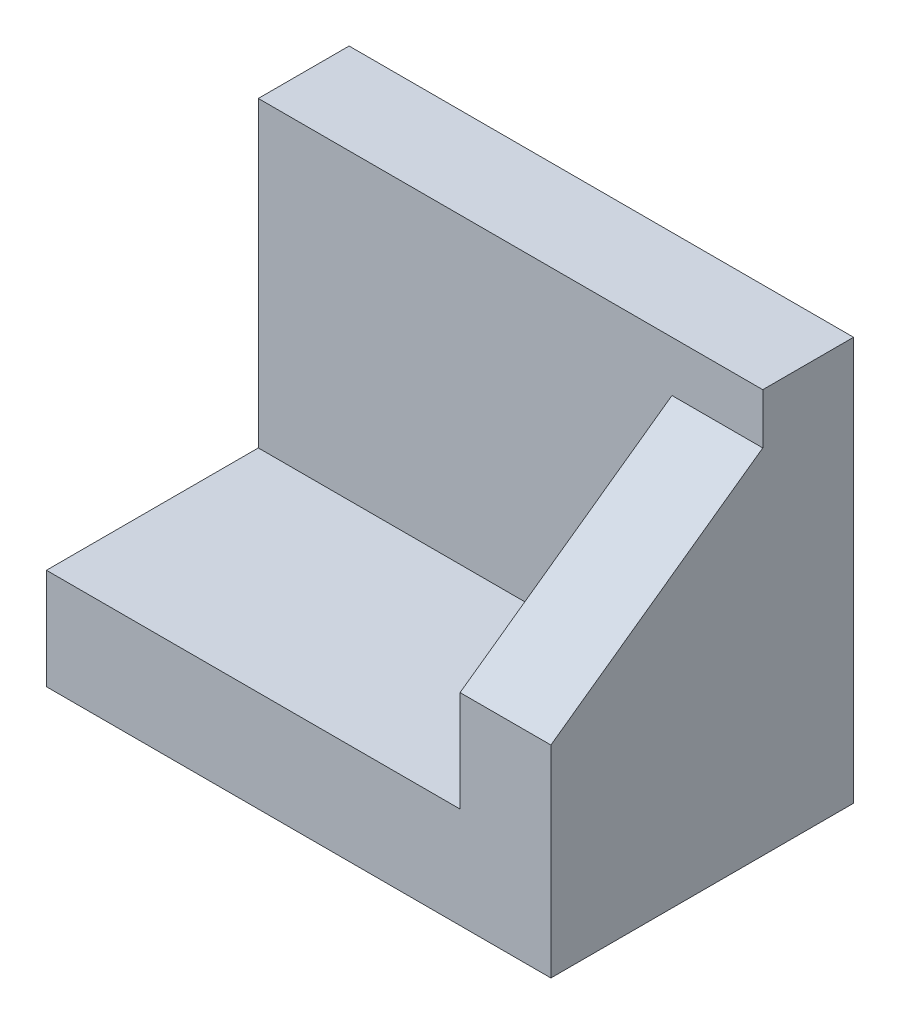
ISO-10303-21;
HEADER;
FILE_DESCRIPTION(('STEP AP214'),'2;1');
FILE_NAME('part.step','',(''),(''),'','','');
FILE_SCHEMA(('AUTOMOTIVE_DESIGN { 1 0 10303 214 1 1 1 1 }'));
ENDSEC;
DATA;
#1=APPLICATION_CONTEXT('core data for automotive mechanical design processes');
#2=APPLICATION_PROTOCOL_DEFINITION('international standard','automotive_design',2000,#1);
#3=PRODUCT_CONTEXT('',#1,'mechanical');
#4=PRODUCT('Part','Part','',(#3));
#5=PRODUCT_RELATED_PRODUCT_CATEGORY('part','',(#4));
#6=PRODUCT_DEFINITION_FORMATION('','',#4);
#7=PRODUCT_DEFINITION_CONTEXT('part definition',#1,'design');
#8=PRODUCT_DEFINITION('design','',#6,#7);
#9=PRODUCT_DEFINITION_SHAPE('','',#8);
#10=(LENGTH_UNIT() NAMED_UNIT(*) SI_UNIT(.MILLI.,.METRE.));
#11=(NAMED_UNIT(*) PLANE_ANGLE_UNIT() SI_UNIT($,.RADIAN.));
#12=(NAMED_UNIT(*) SI_UNIT($,.STERADIAN.) SOLID_ANGLE_UNIT());
#13=UNCERTAINTY_MEASURE_WITH_UNIT(LENGTH_MEASURE(1.E-05),#10,'distance_accuracy_value','');
#14=(GEOMETRIC_REPRESENTATION_CONTEXT(3) GLOBAL_UNCERTAINTY_ASSIGNED_CONTEXT((#13)) GLOBAL_UNIT_ASSIGNED_CONTEXT((#10,
#11,#12)) REPRESENTATION_CONTEXT('',''));
#15=CARTESIAN_POINT('',(0.,0.,0.));
#16=DIRECTION('',(0.,0.,1.));
#17=DIRECTION('',(1.,0.,0.));
#18=AXIS2_PLACEMENT_3D('',#15,#16,#17);
#19=CARTESIAN_POINT('',(0.,0.,18.));
#20=DIRECTION('',(0.,0.,-1.));
#21=DIRECTION('',(-1.,0.,0.));
#22=AXIS2_PLACEMENT_3D('',#19,#20,#21);
#23=PLANE('',#22);
#24=DIRECTION('',(0.,1.,0.));
#25=VECTOR('',#24,1.);
#26=CARTESIAN_POINT('',(82.,20.,18.));
#27=LINE('',#26,#25);
#28=CARTESIAN_POINT('',(82.,20.,18.));
#29=VERTEX_POINT('',#28);
#30=CARTESIAN_POINT('',(82.,70.,18.));
#31=VERTEX_POINT('',#30);
#32=EDGE_CURVE('E84',#29,#31,#27,.T.);
#33=ORIENTED_EDGE('',*,*,#32,.T.);
#34=DIRECTION('',(-1.,0.,0.));
#35=VECTOR('',#34,1.);
#36=CARTESIAN_POINT('',(0.,70.,18.));
#37=LINE('',#36,#35);
#38=CARTESIAN_POINT('',(100.,70.,18.));
#39=VERTEX_POINT('',#38);
#40=EDGE_CURVE('E89',#39,#31,#37,.T.);
#41=ORIENTED_EDGE('',*,*,#40,.F.);
#42=DIRECTION('',(0.,-1.,0.));
#43=VECTOR('',#42,1.);
#44=CARTESIAN_POINT('',(100.,80.,18.));
#45=LINE('',#44,#43);
#46=CARTESIAN_POINT('',(100.,80.,18.));
#47=VERTEX_POINT('',#46);
#48=EDGE_CURVE('E76',#47,#39,#45,.T.);
#49=ORIENTED_EDGE('',*,*,#48,.F.);
#50=CARTESIAN_POINT('',(0.,80.,18.));
#51=DIRECTION('',(1.,0.,0.));
#52=VECTOR('',#51,1.);
#53=LINE('',#50,#52);
#54=CARTESIAN_POINT('',(0.,80.,18.));
#55=VERTEX_POINT('',#54);
#56=EDGE_CURVE('E422',#55,#47,#53,.T.);
#57=ORIENTED_EDGE('',*,*,#56,.F.);
#58=DIRECTION('',(0.,-1.,0.));
#59=VECTOR('',#58,1.);
#60=CARTESIAN_POINT('',(0.,80.,18.));
#61=LINE('',#60,#59);
#62=CARTESIAN_POINT('',(0.,20.,18.));
#63=VERTEX_POINT('',#62);
#64=EDGE_CURVE('E297',#55,#63,#61,.T.);
#65=ORIENTED_EDGE('',*,*,#64,.T.);
#66=CARTESIAN_POINT('',(0.,20.,18.));
#67=DIRECTION('',(1.,0.,0.));
#68=VECTOR('',#67,1.);
#69=LINE('',#66,#68);
#70=EDGE_CURVE('E404',#63,#29,#69,.T.);
#71=ORIENTED_EDGE('',*,*,#70,.T.);
#72=EDGE_LOOP('',(#33,#41,#49,#57,#65,#71));
#73=FACE_BOUND('',#72,.T.);
#74=ADVANCED_FACE('F65',(#73),#23,.F.);
#75=CARTESIAN_POINT('',(0.,20.,0.));
#76=DIRECTION('',(0.,-1.,0.));
#77=DIRECTION('',(0.,0.,-1.));
#78=AXIS2_PLACEMENT_3D('',#75,#76,#77);
#79=PLANE('',#78);
#80=DIRECTION('',(0.,0.,-1.));
#81=VECTOR('',#80,1.);
#82=CARTESIAN_POINT('',(82.,20.,60.));
#83=LINE('',#82,#81);
#84=CARTESIAN_POINT('',(82.,20.,60.));
#85=VERTEX_POINT('',#84);
#86=EDGE_CURVE('E143',#85,#29,#83,.T.);
#87=ORIENTED_EDGE('',*,*,#86,.T.);
#88=ORIENTED_EDGE('',*,*,#70,.F.);
#89=DIRECTION('',(0.,0.,1.));
#90=VECTOR('',#89,1.);
#91=CARTESIAN_POINT('',(0.,20.,18.));
#92=LINE('',#91,#90);
#93=CARTESIAN_POINT('',(0.,20.,60.));
#94=VERTEX_POINT('',#93);
#95=EDGE_CURVE('E345',#63,#94,#92,.T.);
#96=ORIENTED_EDGE('',*,*,#95,.T.);
#97=CARTESIAN_POINT('',(0.,20.,60.));
#98=DIRECTION('',(1.,0.,0.));
#99=VECTOR('',#98,1.);
#100=LINE('',#97,#99);
#101=EDGE_CURVE('E402',#94,#85,#100,.T.);
#102=ORIENTED_EDGE('',*,*,#101,.T.);
#103=EDGE_LOOP('',(#87,#88,#96,#102));
#104=FACE_BOUND('',#103,.T.);
#105=ADVANCED_FACE('F186',(#104),#79,.F.);
#106=CARTESIAN_POINT('',(100.,0.,0.));
#107=DIRECTION('',(1.,0.,0.));
#108=DIRECTION('',(0.,0.,-1.));
#109=AXIS2_PLACEMENT_3D('',#106,#107,#108);
#110=PLANE('',#109);
#111=ORIENTED_EDGE('',*,*,#48,.T.);
#112=DIRECTION('',(0.,-0.581238193719096,0.813733471206735));
#113=VECTOR('',#112,1.);
#114=CARTESIAN_POINT('',(100.,70.,18.));
#115=LINE('',#114,#113);
#116=CARTESIAN_POINT('',(100.,40.,60.));
#117=VERTEX_POINT('',#116);
#118=EDGE_CURVE('E169',#39,#117,#115,.T.);
#119=ORIENTED_EDGE('',*,*,#118,.T.);
#120=DIRECTION('',(0.,-1.,0.));
#121=VECTOR('',#120,1.);
#122=CARTESIAN_POINT('',(100.,40.,60.));
#123=LINE('',#122,#121);
#124=CARTESIAN_POINT('',(100.,20.,60.));
#125=VERTEX_POINT('',#124);
#126=EDGE_CURVE('E166',#117,#125,#123,.T.);
#127=ORIENTED_EDGE('',*,*,#126,.T.);
#128=DIRECTION('',(0.,-1.,0.));
#129=VECTOR('',#128,1.);
#130=CARTESIAN_POINT('',(100.,20.,60.));
#131=LINE('',#130,#129);
#132=CARTESIAN_POINT('',(100.,0.,60.));
#133=VERTEX_POINT('',#132);
#134=EDGE_CURVE('E12',#125,#133,#131,.T.);
#135=ORIENTED_EDGE('',*,*,#134,.T.);
#136=DIRECTION('',(0.,0.,-1.));
#137=VECTOR('',#136,1.);
#138=CARTESIAN_POINT('',(100.,0.,60.));
#139=LINE('',#138,#137);
#140=CARTESIAN_POINT('',(100.,0.,0.));
#141=VERTEX_POINT('',#140);
#142=EDGE_CURVE('E224',#133,#141,#139,.T.);
#143=ORIENTED_EDGE('',*,*,#142,.T.);
#144=DIRECTION('',(0.,1.,0.));
#145=VECTOR('',#144,1.);
#146=CARTESIAN_POINT('',(100.,0.,0.));
#147=LINE('',#146,#145);
#148=CARTESIAN_POINT('',(100.,80.,0.));
#149=VERTEX_POINT('',#148);
#150=EDGE_CURVE('E428',#141,#149,#147,.T.);
#151=ORIENTED_EDGE('',*,*,#150,.T.);
#152=DIRECTION('',(0.,0.,1.));
#153=VECTOR('',#152,1.);
#154=CARTESIAN_POINT('',(100.,80.,0.));
#155=LINE('',#154,#153);
#156=EDGE_CURVE('E433',#149,#47,#155,.T.);
#157=ORIENTED_EDGE('',*,*,#156,.T.);
#158=EDGE_LOOP('',(#111,#119,#127,#135,#143,#151,#157));
#159=FACE_BOUND('',#158,.T.);
#160=ADVANCED_FACE('F67',(#159),#110,.T.);
#161=CARTESIAN_POINT('',(0.,0.,0.));
#162=DIRECTION('',(1.,0.,0.));
#163=DIRECTION('',(0.,0.,-1.));
#164=AXIS2_PLACEMENT_3D('',#161,#162,#163);
#165=PLANE('',#164);
#166=DIRECTION('',(0.,0.,-1.));
#167=VECTOR('',#166,1.);
#168=CARTESIAN_POINT('',(0.,0.,60.));
#169=LINE('',#168,#167);
#170=CARTESIAN_POINT('',(0.,0.,60.));
#171=VERTEX_POINT('',#170);
#172=CARTESIAN_POINT('',(0.,0.,0.));
#173=VERTEX_POINT('',#172);
#174=EDGE_CURVE('E337',#171,#173,#169,.T.);
#175=ORIENTED_EDGE('',*,*,#174,.F.);
#176=DIRECTION('',(0.,-1.,0.));
#177=VECTOR('',#176,1.);
#178=CARTESIAN_POINT('',(0.,20.,60.));
#179=LINE('',#178,#177);
#180=EDGE_CURVE('E340',#94,#171,#179,.T.);
#181=ORIENTED_EDGE('',*,*,#180,.F.);
#182=ORIENTED_EDGE('',*,*,#95,.F.);
#183=ORIENTED_EDGE('',*,*,#64,.F.);
#184=DIRECTION('',(0.,0.,1.));
#185=VECTOR('',#184,1.);
#186=CARTESIAN_POINT('',(0.,80.,0.));
#187=LINE('',#186,#185);
#188=CARTESIAN_POINT('',(0.,80.,0.));
#189=VERTEX_POINT('',#188);
#190=EDGE_CURVE('E285',#189,#55,#187,.T.);
#191=ORIENTED_EDGE('',*,*,#190,.F.);
#192=DIRECTION('',(0.,1.,0.));
#193=VECTOR('',#192,1.);
#194=CARTESIAN_POINT('',(0.,0.,0.));
#195=LINE('',#194,#193);
#196=EDGE_CURVE('E271',#173,#189,#195,.T.);
#197=ORIENTED_EDGE('',*,*,#196,.F.);
#198=EDGE_LOOP('',(#175,#181,#182,#183,#191,#197));
#199=FACE_BOUND('',#198,.T.);
#200=ADVANCED_FACE('F355',(#199),#165,.F.);
#201=CARTESIAN_POINT('',(0.,0.,0.));
#202=DIRECTION('',(0.,0.,1.));
#203=DIRECTION('',(1.,0.,0.));
#204=AXIS2_PLACEMENT_3D('',#201,#202,#203);
#205=PLANE('',#204);
#206=CARTESIAN_POINT('',(0.,80.,0.));
#207=DIRECTION('',(1.,0.,0.));
#208=VECTOR('',#207,1.);
#209=LINE('',#206,#208);
#210=EDGE_CURVE('E344',#189,#149,#209,.T.);
#211=ORIENTED_EDGE('',*,*,#210,.T.);
#212=ORIENTED_EDGE('',*,*,#150,.F.);
#213=CARTESIAN_POINT('',(0.,0.,0.));
#214=DIRECTION('',(1.,0.,0.));
#215=VECTOR('',#214,1.);
#216=LINE('',#213,#215);
#217=EDGE_CURVE('E423',#173,#141,#216,.T.);
#218=ORIENTED_EDGE('',*,*,#217,.F.);
#219=ORIENTED_EDGE('',*,*,#196,.T.);
#220=EDGE_LOOP('',(#211,#212,#218,#219));
#221=FACE_BOUND('',#220,.T.);
#222=ADVANCED_FACE('F240',(#221),#205,.F.);
#223=CARTESIAN_POINT('',(0.,0.,0.));
#224=DIRECTION('',(0.,1.,0.));
#225=DIRECTION('',(0.,0.,1.));
#226=AXIS2_PLACEMENT_3D('',#223,#224,#225);
#227=PLANE('',#226);
#228=ORIENTED_EDGE('',*,*,#217,.T.);
#229=ORIENTED_EDGE('',*,*,#142,.F.);
#230=CARTESIAN_POINT('',(0.,0.,60.));
#231=DIRECTION('',(1.,0.,0.));
#232=VECTOR('',#231,1.);
#233=LINE('',#230,#232);
#234=EDGE_CURVE('E405',#171,#133,#233,.T.);
#235=ORIENTED_EDGE('',*,*,#234,.F.);
#236=ORIENTED_EDGE('',*,*,#174,.T.);
#237=EDGE_LOOP('',(#228,#229,#235,#236));
#238=FACE_BOUND('',#237,.T.);
#239=ADVANCED_FACE('F230',(#238),#227,.F.);
#240=CARTESIAN_POINT('',(0.,80.,0.));
#241=DIRECTION('',(0.,-1.,0.));
#242=DIRECTION('',(0.,0.,-1.));
#243=AXIS2_PLACEMENT_3D('',#240,#241,#242);
#244=PLANE('',#243);
#245=ORIENTED_EDGE('',*,*,#56,.T.);
#246=ORIENTED_EDGE('',*,*,#156,.F.);
#247=ORIENTED_EDGE('',*,*,#210,.F.);
#248=ORIENTED_EDGE('',*,*,#190,.T.);
#249=EDGE_LOOP('',(#245,#246,#247,#248));
#250=FACE_BOUND('',#249,.T.);
#251=ADVANCED_FACE('F185',(#250),#244,.F.);
#252=CARTESIAN_POINT('',(0.,0.,60.));
#253=DIRECTION('',(0.,0.,-1.));
#254=DIRECTION('',(-1.,0.,0.));
#255=AXIS2_PLACEMENT_3D('',#252,#253,#254);
#256=PLANE('',#255);
#257=ORIENTED_EDGE('',*,*,#234,.T.);
#258=ORIENTED_EDGE('',*,*,#134,.F.);
#259=ORIENTED_EDGE('',*,*,#126,.F.);
#260=CARTESIAN_POINT('',(82.,40.,60.));
#261=DIRECTION('',(1.,0.,0.));
#262=VECTOR('',#261,1.);
#263=LINE('',#260,#262);
#264=CARTESIAN_POINT('',(82.,40.,60.));
#265=VERTEX_POINT('',#264);
#266=EDGE_CURVE('E155',#265,#117,#263,.T.);
#267=ORIENTED_EDGE('',*,*,#266,.F.);
#268=DIRECTION('',(0.,-1.,0.));
#269=VECTOR('',#268,1.);
#270=CARTESIAN_POINT('',(82.,40.,60.));
#271=LINE('',#270,#269);
#272=EDGE_CURVE('E137',#265,#85,#271,.T.);
#273=ORIENTED_EDGE('',*,*,#272,.T.);
#274=ORIENTED_EDGE('',*,*,#101,.F.);
#275=ORIENTED_EDGE('',*,*,#180,.T.);
#276=EDGE_LOOP('',(#257,#258,#259,#267,#273,#274,#275));
#277=FACE_BOUND('',#276,.T.);
#278=ADVANCED_FACE('F164',(#277),#256,.F.);
#279=CARTESIAN_POINT('',(82.,0.,0.));
#280=DIRECTION('',(1.,0.,0.));
#281=DIRECTION('',(0.,0.,-1.));
#282=AXIS2_PLACEMENT_3D('',#279,#280,#281);
#283=PLANE('',#282);
#284=ORIENTED_EDGE('',*,*,#86,.F.);
#285=ORIENTED_EDGE('',*,*,#272,.F.);
#286=DIRECTION('',(0.,-0.581238193719096,0.813733471206735));
#287=VECTOR('',#286,1.);
#288=CARTESIAN_POINT('',(82.,70.,18.));
#289=LINE('',#288,#287);
#290=EDGE_CURVE('E141',#31,#265,#289,.T.);
#291=ORIENTED_EDGE('',*,*,#290,.F.);
#292=ORIENTED_EDGE('',*,*,#32,.F.);
#293=EDGE_LOOP('',(#284,#285,#291,#292));
#294=FACE_BOUND('',#293,.T.);
#295=ADVANCED_FACE('F140',(#294),#283,.F.);
#296=CARTESIAN_POINT('',(0.,54.8648648648649,39.1891891891892));
#297=DIRECTION('',(0.,-0.813733471206735,-0.581238193719097));
#298=DIRECTION('',(0.,0.581238193719097,-0.813733471206735));
#299=AXIS2_PLACEMENT_3D('',#296,#297,#298);
#300=PLANE('',#299);
#301=ORIENTED_EDGE('',*,*,#266,.T.);
#302=ORIENTED_EDGE('',*,*,#118,.F.);
#303=ORIENTED_EDGE('',*,*,#40,.T.);
#304=ORIENTED_EDGE('',*,*,#290,.T.);
#305=EDGE_LOOP('',(#301,#302,#303,#304));
#306=FACE_BOUND('',#305,.T.);
#307=ADVANCED_FACE('F153',(#306),#300,.F.);
#308=CLOSED_SHELL('',(#74,#105,#160,#200,#222,#239,#251,#278,#295,#307));
#309=MANIFOLD_SOLID_BREP('B2',#308);
#310=ADVANCED_BREP_SHAPE_REPRESENTATION('',(#18,#309),#14);
#311=SHAPE_DEFINITION_REPRESENTATION(#9,#310);
ENDSEC;
END-ISO-10303-21;
